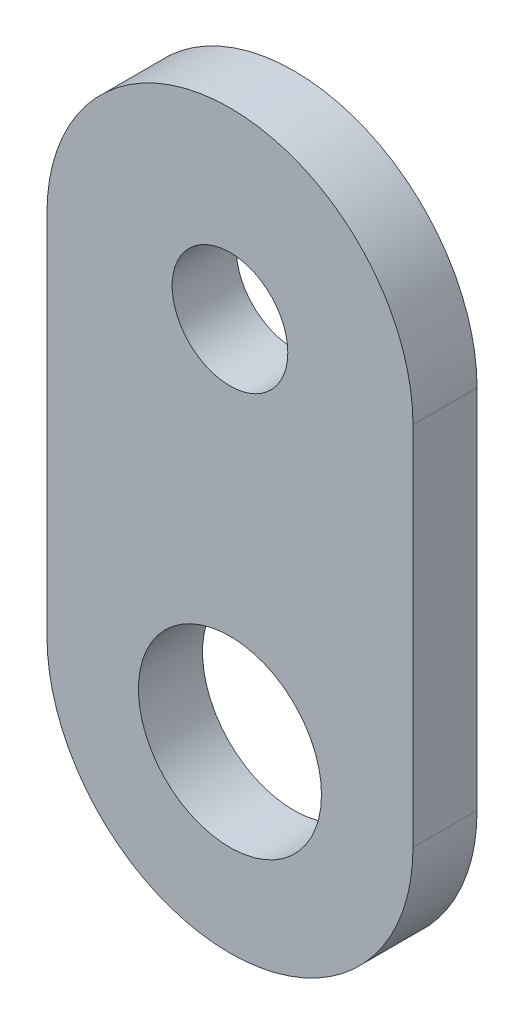
ISO-10303-21;
HEADER;
FILE_DESCRIPTION(('STEP AP214'),'2;1');
FILE_NAME('part.step','',(''),(''),'','','');
FILE_SCHEMA(('AUTOMOTIVE_DESIGN { 1 0 10303 214 1 1 1 1 }'));
ENDSEC;
DATA;
#1=APPLICATION_CONTEXT('core data for automotive mechanical design processes');
#2=APPLICATION_PROTOCOL_DEFINITION('international standard','automotive_design',2000,#1);
#3=PRODUCT_CONTEXT('',#1,'mechanical');
#4=PRODUCT('Part','Part','',(#3));
#5=PRODUCT_RELATED_PRODUCT_CATEGORY('part','',(#4));
#6=PRODUCT_DEFINITION_FORMATION('','',#4);
#7=PRODUCT_DEFINITION_CONTEXT('part definition',#1,'design');
#8=PRODUCT_DEFINITION('design','',#6,#7);
#9=PRODUCT_DEFINITION_SHAPE('','',#8);
#10=(LENGTH_UNIT() NAMED_UNIT(*) SI_UNIT(.MILLI.,.METRE.));
#11=(NAMED_UNIT(*) PLANE_ANGLE_UNIT() SI_UNIT($,.RADIAN.));
#12=(NAMED_UNIT(*) SI_UNIT($,.STERADIAN.) SOLID_ANGLE_UNIT());
#13=UNCERTAINTY_MEASURE_WITH_UNIT(LENGTH_MEASURE(1.E-05),#10,'distance_accuracy_value','');
#14=(GEOMETRIC_REPRESENTATION_CONTEXT(3) GLOBAL_UNCERTAINTY_ASSIGNED_CONTEXT((#13)) GLOBAL_UNIT_ASSIGNED_CONTEXT((#10,
#11,#12)) REPRESENTATION_CONTEXT('',''));
#15=CARTESIAN_POINT('',(0.,0.,0.));
#16=DIRECTION('',(0.,0.,1.));
#17=DIRECTION('',(1.,0.,0.));
#18=AXIS2_PLACEMENT_3D('',#15,#16,#17);
#19=CARTESIAN_POINT('',(25.4,0.,8.89));
#20=DIRECTION('',(0.,0.,-1.));
#21=DIRECTION('',(-1.,0.,0.));
#22=AXIS2_PLACEMENT_3D('',#19,#20,#21);
#23=CYLINDRICAL_SURFACE('',#22,25.4);
#24=CARTESIAN_POINT('',(25.4,0.,0.));
#25=DIRECTION('',(0.,0.,1.));
#26=DIRECTION('',(-1.,0.,0.));
#27=AXIS2_PLACEMENT_3D('',#24,#25,#26);
#28=CIRCLE('',#27,25.4);
#29=CARTESIAN_POINT('',(0.,0.,0.));
#30=VERTEX_POINT('',#29);
#31=CARTESIAN_POINT('',(50.8,0.,0.));
#32=VERTEX_POINT('',#31);
#33=EDGE_CURVE('E117',#30,#32,#28,.T.);
#34=ORIENTED_EDGE('',*,*,#33,.T.);
#35=DIRECTION('',(0.,0.,-1.));
#36=VECTOR('',#35,1.);
#37=CARTESIAN_POINT('',(50.8,0.,8.89));
#38=LINE('',#37,#36);
#39=CARTESIAN_POINT('',(50.8,0.,8.89));
#40=VERTEX_POINT('',#39);
#41=EDGE_CURVE('E11',#40,#32,#38,.T.);
#42=ORIENTED_EDGE('',*,*,#41,.F.);
#43=CARTESIAN_POINT('',(25.4,0.,8.89));
#44=DIRECTION('',(0.,0.,1.));
#45=DIRECTION('',(-1.,0.,0.));
#46=AXIS2_PLACEMENT_3D('',#43,#44,#45);
#47=CIRCLE('',#46,25.4);
#48=CARTESIAN_POINT('',(0.,0.,8.89));
#49=VERTEX_POINT('',#48);
#50=EDGE_CURVE('E101',#49,#40,#47,.T.);
#51=ORIENTED_EDGE('',*,*,#50,.F.);
#52=DIRECTION('',(0.,0.,-1.));
#53=VECTOR('',#52,1.);
#54=CARTESIAN_POINT('',(0.,0.,8.89));
#55=LINE('',#54,#53);
#56=EDGE_CURVE('E113',#49,#30,#55,.T.);
#57=ORIENTED_EDGE('',*,*,#56,.T.);
#58=EDGE_LOOP('',(#34,#42,#51,#57));
#59=FACE_BOUND('',#58,.T.);
#60=ADVANCED_FACE('F49',(#59),#23,.T.);
#61=CARTESIAN_POINT('',(50.8,50.8,8.89));
#62=DIRECTION('',(-1.,0.,0.));
#63=DIRECTION('',(0.,-1.,0.));
#64=AXIS2_PLACEMENT_3D('',#61,#62,#63);
#65=PLANE('',#64);
#66=DIRECTION('',(0.,1.,0.));
#67=VECTOR('',#66,1.);
#68=CARTESIAN_POINT('',(50.8,50.8,0.));
#69=LINE('',#68,#67);
#70=CARTESIAN_POINT('',(50.8,50.8,0.));
#71=VERTEX_POINT('',#70);
#72=EDGE_CURVE('E106',#32,#71,#69,.T.);
#73=ORIENTED_EDGE('',*,*,#72,.T.);
#74=DIRECTION('',(0.,0.,-1.));
#75=VECTOR('',#74,1.);
#76=CARTESIAN_POINT('',(50.8,50.8,8.89));
#77=LINE('',#76,#75);
#78=CARTESIAN_POINT('',(50.8,50.8,8.89));
#79=VERTEX_POINT('',#78);
#80=EDGE_CURVE('E58',#79,#71,#77,.T.);
#81=ORIENTED_EDGE('',*,*,#80,.F.);
#82=DIRECTION('',(0.,1.,0.));
#83=VECTOR('',#82,1.);
#84=CARTESIAN_POINT('',(50.8,50.8,8.89));
#85=LINE('',#84,#83);
#86=EDGE_CURVE('E96',#40,#79,#85,.T.);
#87=ORIENTED_EDGE('',*,*,#86,.F.);
#88=ORIENTED_EDGE('',*,*,#41,.T.);
#89=EDGE_LOOP('',(#73,#81,#87,#88));
#90=FACE_BOUND('',#89,.T.);
#91=ADVANCED_FACE('F105',(#90),#65,.F.);
#92=CARTESIAN_POINT('',(25.4,50.8,8.89));
#93=DIRECTION('',(0.,0.,-1.));
#94=DIRECTION('',(-1.,0.,0.));
#95=AXIS2_PLACEMENT_3D('',#92,#93,#94);
#96=CYLINDRICAL_SURFACE('',#95,25.4);
#97=CARTESIAN_POINT('',(25.4,50.8,0.));
#98=DIRECTION('',(0.,0.,1.));
#99=DIRECTION('',(-1.,0.,0.));
#100=AXIS2_PLACEMENT_3D('',#97,#98,#99);
#101=CIRCLE('',#100,25.4);
#102=CARTESIAN_POINT('',(0.,50.8,0.));
#103=VERTEX_POINT('',#102);
#104=EDGE_CURVE('E83',#71,#103,#101,.T.);
#105=ORIENTED_EDGE('',*,*,#104,.T.);
#106=DIRECTION('',(0.,0.,-1.));
#107=VECTOR('',#106,1.);
#108=CARTESIAN_POINT('',(0.,50.8,8.89));
#109=LINE('',#108,#107);
#110=CARTESIAN_POINT('',(0.,50.8,8.89));
#111=VERTEX_POINT('',#110);
#112=EDGE_CURVE('E108',#111,#103,#109,.T.);
#113=ORIENTED_EDGE('',*,*,#112,.F.);
#114=CARTESIAN_POINT('',(25.4,50.8,8.89));
#115=DIRECTION('',(0.,0.,1.));
#116=DIRECTION('',(-1.,0.,0.));
#117=AXIS2_PLACEMENT_3D('',#114,#115,#116);
#118=CIRCLE('',#117,25.4);
#119=EDGE_CURVE('E99',#79,#111,#118,.T.);
#120=ORIENTED_EDGE('',*,*,#119,.F.);
#121=ORIENTED_EDGE('',*,*,#80,.T.);
#122=EDGE_LOOP('',(#105,#113,#120,#121));
#123=FACE_BOUND('',#122,.T.);
#124=ADVANCED_FACE('F109',(#123),#96,.T.);
#125=CARTESIAN_POINT('',(0.,0.,8.89));
#126=DIRECTION('',(1.,0.,0.));
#127=DIRECTION('',(0.,1.,0.));
#128=AXIS2_PLACEMENT_3D('',#125,#126,#127);
#129=PLANE('',#128);
#130=DIRECTION('',(0.,-1.,0.));
#131=VECTOR('',#130,1.);
#132=CARTESIAN_POINT('',(0.,0.,0.));
#133=LINE('',#132,#131);
#134=EDGE_CURVE('E89',#103,#30,#133,.T.);
#135=ORIENTED_EDGE('',*,*,#134,.T.);
#136=ORIENTED_EDGE('',*,*,#56,.F.);
#137=DIRECTION('',(0.,-1.,0.));
#138=VECTOR('',#137,1.);
#139=CARTESIAN_POINT('',(0.,0.,8.89));
#140=LINE('',#139,#138);
#141=EDGE_CURVE('E66',#111,#49,#140,.T.);
#142=ORIENTED_EDGE('',*,*,#141,.F.);
#143=ORIENTED_EDGE('',*,*,#112,.T.);
#144=EDGE_LOOP('',(#135,#136,#142,#143));
#145=FACE_BOUND('',#144,.T.);
#146=ADVANCED_FACE('F131',(#145),#129,.F.);
#147=CARTESIAN_POINT('',(25.4,0.,8.89));
#148=DIRECTION('',(0.,0.,-1.));
#149=DIRECTION('',(-1.,0.,0.));
#150=AXIS2_PLACEMENT_3D('',#147,#148,#149);
#151=PLANE('',#150);
#152=CARTESIAN_POINT('',(25.4,0.,8.89));
#153=DIRECTION('',(0.,0.,1.));
#154=DIRECTION('',(1.,0.,0.));
#155=AXIS2_PLACEMENT_3D('',#152,#153,#154);
#156=CIRCLE('',#155,12.7);
#157=CARTESIAN_POINT('',(38.1,0.,8.89));
#158=VERTEX_POINT('',#157);
#159=EDGE_CURVE('E146',#158,#158,#156,.T.);
#160=ORIENTED_EDGE('',*,*,#159,.F.);
#161=EDGE_LOOP('',(#160));
#162=FACE_BOUND('',#161,.T.);
#163=CARTESIAN_POINT('',(25.4,50.8,8.89));
#164=DIRECTION('',(0.,0.,1.));
#165=DIRECTION('',(1.,0.,0.));
#166=AXIS2_PLACEMENT_3D('',#163,#164,#165);
#167=CIRCLE('',#166,8.0264);
#168=CARTESIAN_POINT('',(33.4264,50.8,8.89));
#169=VERTEX_POINT('',#168);
#170=EDGE_CURVE('E142',#169,#169,#167,.T.);
#171=ORIENTED_EDGE('',*,*,#170,.F.);
#172=EDGE_LOOP('',(#171));
#173=FACE_BOUND('',#172,.T.);
#174=ORIENTED_EDGE('',*,*,#50,.T.);
#175=ORIENTED_EDGE('',*,*,#86,.T.);
#176=ORIENTED_EDGE('',*,*,#119,.T.);
#177=ORIENTED_EDGE('',*,*,#141,.T.);
#178=EDGE_LOOP('',(#174,#175,#176,#177));
#179=FACE_BOUND('',#178,.T.);
#180=ADVANCED_FACE('F97',(#162,#173,#179),#151,.F.);
#181=CARTESIAN_POINT('',(25.4,0.,0.));
#182=DIRECTION('',(0.,0.,-1.));
#183=DIRECTION('',(-1.,0.,0.));
#184=AXIS2_PLACEMENT_3D('',#181,#182,#183);
#185=PLANE('',#184);
#186=CARTESIAN_POINT('',(25.4,0.,0.));
#187=DIRECTION('',(0.,0.,1.));
#188=DIRECTION('',(1.,0.,0.));
#189=AXIS2_PLACEMENT_3D('',#186,#187,#188);
#190=CIRCLE('',#189,12.7);
#191=CARTESIAN_POINT('',(38.1,0.,0.));
#192=VERTEX_POINT('',#191);
#193=EDGE_CURVE('E121',#192,#192,#190,.T.);
#194=ORIENTED_EDGE('',*,*,#193,.T.);
#195=EDGE_LOOP('',(#194));
#196=FACE_BOUND('',#195,.T.);
#197=CARTESIAN_POINT('',(25.4,50.8,0.));
#198=DIRECTION('',(0.,0.,1.));
#199=DIRECTION('',(1.,0.,0.));
#200=AXIS2_PLACEMENT_3D('',#197,#198,#199);
#201=CIRCLE('',#200,8.0264);
#202=CARTESIAN_POINT('',(33.4264,50.8,0.));
#203=VERTEX_POINT('',#202);
#204=EDGE_CURVE('E138',#203,#203,#201,.T.);
#205=ORIENTED_EDGE('',*,*,#204,.T.);
#206=EDGE_LOOP('',(#205));
#207=FACE_BOUND('',#206,.T.);
#208=ORIENTED_EDGE('',*,*,#33,.F.);
#209=ORIENTED_EDGE('',*,*,#134,.F.);
#210=ORIENTED_EDGE('',*,*,#104,.F.);
#211=ORIENTED_EDGE('',*,*,#72,.F.);
#212=EDGE_LOOP('',(#208,#209,#210,#211));
#213=FACE_BOUND('',#212,.T.);
#214=ADVANCED_FACE('F134',(#196,#207,#213),#185,.T.);
#215=CARTESIAN_POINT('',(25.4,50.8,0.));
#216=DIRECTION('',(0.,0.,1.));
#217=DIRECTION('',(1.,0.,0.));
#218=AXIS2_PLACEMENT_3D('',#215,#216,#217);
#219=CYLINDRICAL_SURFACE('',#218,8.0264);
#220=ORIENTED_EDGE('',*,*,#204,.F.);
#221=EDGE_LOOP('',(#220));
#222=FACE_BOUND('',#221,.T.);
#223=ORIENTED_EDGE('',*,*,#170,.T.);
#224=EDGE_LOOP('',(#223));
#225=FACE_BOUND('',#224,.T.);
#226=ADVANCED_FACE('F159',(#222,#225),#219,.F.);
#227=CARTESIAN_POINT('',(25.4,0.,0.));
#228=DIRECTION('',(0.,0.,1.));
#229=DIRECTION('',(1.,0.,0.));
#230=AXIS2_PLACEMENT_3D('',#227,#228,#229);
#231=CYLINDRICAL_SURFACE('',#230,12.7);
#232=ORIENTED_EDGE('',*,*,#193,.F.);
#233=EDGE_LOOP('',(#232));
#234=FACE_BOUND('',#233,.T.);
#235=ORIENTED_EDGE('',*,*,#159,.T.);
#236=EDGE_LOOP('',(#235));
#237=FACE_BOUND('',#236,.T.);
#238=ADVANCED_FACE('F156',(#234,#237),#231,.F.);
#239=CLOSED_SHELL('',(#60,#91,#124,#146,#180,#214,#226,#238));
#240=MANIFOLD_SOLID_BREP('B2',#239);
#241=ADVANCED_BREP_SHAPE_REPRESENTATION('',(#18,#240),#14);
#242=SHAPE_DEFINITION_REPRESENTATION(#9,#241);
ENDSEC;
END-ISO-10303-21;
